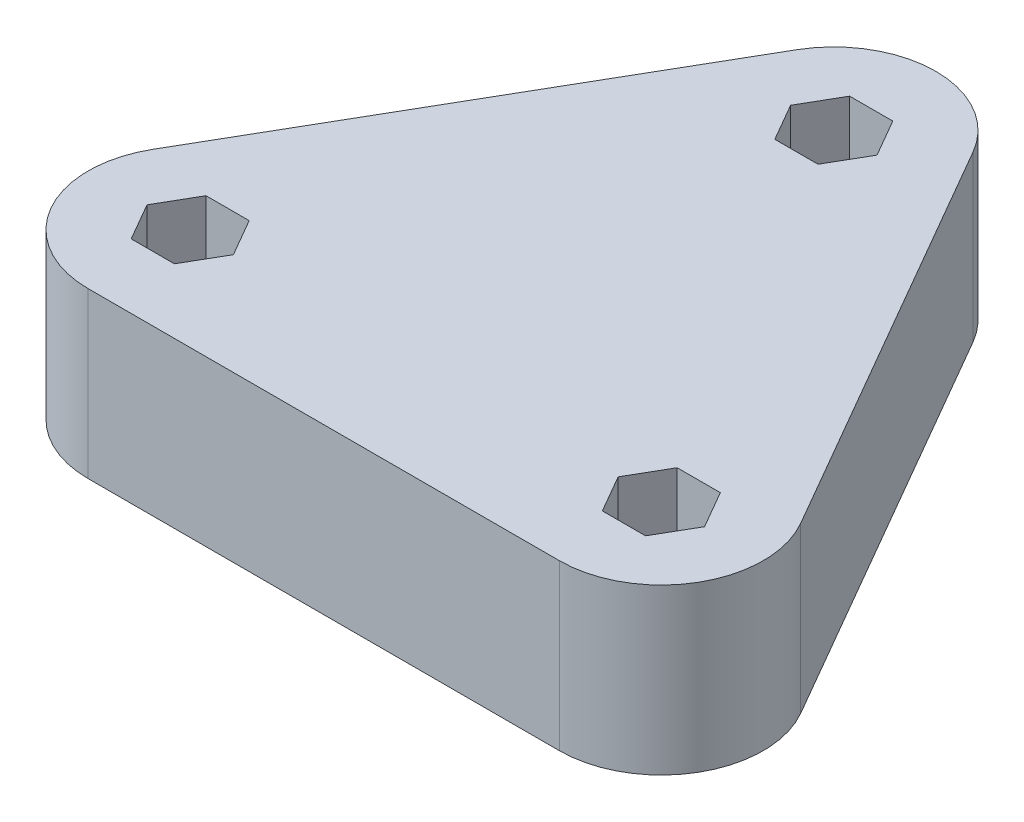
ISO-10303-21;
HEADER;
FILE_DESCRIPTION(('STEP AP214'),'2;1');
FILE_NAME('part.step','',(''),(''),'','','');
FILE_SCHEMA(('AUTOMOTIVE_DESIGN { 1 0 10303 214 1 1 1 1 }'));
ENDSEC;
DATA;
#1=APPLICATION_CONTEXT('core data for automotive mechanical design processes');
#2=APPLICATION_PROTOCOL_DEFINITION('international standard','automotive_design',2000,#1);
#3=PRODUCT_CONTEXT('',#1,'mechanical');
#4=PRODUCT('Part','Part','',(#3));
#5=PRODUCT_RELATED_PRODUCT_CATEGORY('part','',(#4));
#6=PRODUCT_DEFINITION_FORMATION('','',#4);
#7=PRODUCT_DEFINITION_CONTEXT('part definition',#1,'design');
#8=PRODUCT_DEFINITION('design','',#6,#7);
#9=PRODUCT_DEFINITION_SHAPE('','',#8);
#10=(LENGTH_UNIT() NAMED_UNIT(*) SI_UNIT(.MILLI.,.METRE.));
#11=(NAMED_UNIT(*) PLANE_ANGLE_UNIT() SI_UNIT($,.RADIAN.));
#12=(NAMED_UNIT(*) SI_UNIT($,.STERADIAN.) SOLID_ANGLE_UNIT());
#13=UNCERTAINTY_MEASURE_WITH_UNIT(LENGTH_MEASURE(1.E-05),#10,'distance_accuracy_value','');
#14=(GEOMETRIC_REPRESENTATION_CONTEXT(3) GLOBAL_UNCERTAINTY_ASSIGNED_CONTEXT((#13)) GLOBAL_UNIT_ASSIGNED_CONTEXT((#10,
#11,#12)) REPRESENTATION_CONTEXT('',''));
#15=CARTESIAN_POINT('',(0.,0.,0.));
#16=DIRECTION('',(0.,0.,1.));
#17=DIRECTION('',(1.,0.,0.));
#18=AXIS2_PLACEMENT_3D('',#15,#16,#17);
#19=CARTESIAN_POINT('',(0.,12.1,-20.));
#20=DIRECTION('',(0.,1.,0.));
#21=DIRECTION('',(0.,0.,1.));
#22=AXIS2_PLACEMENT_3D('',#19,#20,#21);
#23=PLANE('',#22);
#24=CARTESIAN_POINT('',(0.,12.1,-20.));
#25=DIRECTION('',(0.,1.,0.));
#26=DIRECTION('',(0.,0.,1.));
#27=AXIS2_PLACEMENT_3D('',#24,#25,#26);
#28=CIRCLE('',#27,7.49999999999992);
#29=CARTESIAN_POINT('',(6.49519052838323,12.1,-23.7499999999999));
#30=VERTEX_POINT('',#29);
#31=CARTESIAN_POINT('',(-6.49519052838323,12.1,-23.7499999999999));
#32=VERTEX_POINT('',#31);
#33=EDGE_CURVE('E375',#30,#32,#28,.T.);
#34=ORIENTED_EDGE('',*,*,#33,.T.);
#35=DIRECTION('',(-0.499999999999998,0.,0.86602540378444));
#36=VECTOR('',#35,1.);
#37=CARTESIAN_POINT('',(-6.49519052838323,12.1,-23.7499999999999));
#38=LINE('',#37,#36);
#39=CARTESIAN_POINT('',(-23.815698604072,12.1,6.25000000000013));
#40=VERTEX_POINT('',#39);
#41=EDGE_CURVE('E378',#32,#40,#38,.T.);
#42=ORIENTED_EDGE('',*,*,#41,.T.);
#43=CARTESIAN_POINT('',(-17.3205080756887,12.1,10.0000000000001));
#44=DIRECTION('',(0.,1.,0.));
#45=DIRECTION('',(0.,0.,1.));
#46=AXIS2_PLACEMENT_3D('',#43,#44,#45);
#47=CIRCLE('',#46,7.49999999999993);
#48=CARTESIAN_POINT('',(-17.3205080756887,12.1,17.5));
#49=VERTEX_POINT('',#48);
#50=EDGE_CURVE('E380',#40,#49,#47,.T.);
#51=ORIENTED_EDGE('',*,*,#50,.T.);
#52=DIRECTION('',(1.,0.,0.));
#53=VECTOR('',#52,1.);
#54=CARTESIAN_POINT('',(-17.3205080756887,12.1,17.5));
#55=LINE('',#54,#53);
#56=CARTESIAN_POINT('',(17.3205080756887,12.1,17.5));
#57=VERTEX_POINT('',#56);
#58=EDGE_CURVE('E382',#49,#57,#55,.T.);
#59=ORIENTED_EDGE('',*,*,#58,.T.);
#60=CARTESIAN_POINT('',(17.3205080756887,12.1,10.0000000000001));
#61=DIRECTION('',(0.,1.,0.));
#62=DIRECTION('',(0.,0.,1.));
#63=AXIS2_PLACEMENT_3D('',#60,#61,#62);
#64=CIRCLE('',#63,7.49999999999993);
#65=CARTESIAN_POINT('',(23.815698604072,12.1,6.25000000000013));
#66=VERTEX_POINT('',#65);
#67=EDGE_CURVE('E384',#57,#66,#64,.T.);
#68=ORIENTED_EDGE('',*,*,#67,.T.);
#69=DIRECTION('',(-0.499999999999998,0.,-0.86602540378444));
#70=VECTOR('',#69,1.);
#71=CARTESIAN_POINT('',(23.815698604072,12.1,6.25000000000013));
#72=LINE('',#71,#70);
#73=EDGE_CURVE('E386',#66,#30,#72,.T.);
#74=ORIENTED_EDGE('',*,*,#73,.T.);
#75=EDGE_LOOP('',(#34,#42,#51,#59,#68,#74));
#76=FACE_BOUND('',#75,.T.);
#77=DIRECTION('',(-0.499999999999999,0.,0.866025403784439));
#78=VECTOR('',#77,1.);
#79=CARTESIAN_POINT('',(-1.58771324027147,12.1,-22.75));
#80=LINE('',#79,#78);
#81=CARTESIAN_POINT('',(-1.58771324027147,12.1,-22.75));
#82=VERTEX_POINT('',#81);
#83=CARTESIAN_POINT('',(-3.17542648054294,12.1,-20.));
#84=VERTEX_POINT('',#83);
#85=EDGE_CURVE('E352',#82,#84,#80,.T.);
#86=ORIENTED_EDGE('',*,*,#85,.F.);
#87=DIRECTION('',(-1.,0.,0.));
#88=VECTOR('',#87,1.);
#89=CARTESIAN_POINT('',(1.58771324027147,12.1,-22.75));
#90=LINE('',#89,#88);
#91=CARTESIAN_POINT('',(1.58771324027147,12.1,-22.75));
#92=VERTEX_POINT('',#91);
#93=EDGE_CURVE('E350',#92,#82,#90,.T.);
#94=ORIENTED_EDGE('',*,*,#93,.F.);
#95=DIRECTION('',(-0.5,0.,-0.866025403784439));
#96=VECTOR('',#95,1.);
#97=CARTESIAN_POINT('',(3.17542648054294,12.1,-20.));
#98=LINE('',#97,#96);
#99=CARTESIAN_POINT('',(3.17542648054294,12.1,-20.));
#100=VERTEX_POINT('',#99);
#101=EDGE_CURVE('E361',#100,#92,#98,.T.);
#102=ORIENTED_EDGE('',*,*,#101,.F.);
#103=DIRECTION('',(0.5,0.,-0.866025403784439));
#104=VECTOR('',#103,1.);
#105=CARTESIAN_POINT('',(1.58771324027147,12.1,-17.25));
#106=LINE('',#105,#104);
#107=CARTESIAN_POINT('',(1.58771324027147,12.1,-17.25));
#108=VERTEX_POINT('',#107);
#109=EDGE_CURVE('E358',#108,#100,#106,.T.);
#110=ORIENTED_EDGE('',*,*,#109,.F.);
#111=DIRECTION('',(1.,0.,0.));
#112=VECTOR('',#111,1.);
#113=CARTESIAN_POINT('',(-1.58771324027147,12.1,-17.25));
#114=LINE('',#113,#112);
#115=CARTESIAN_POINT('',(-1.58771324027147,12.1,-17.25));
#116=VERTEX_POINT('',#115);
#117=EDGE_CURVE('E356',#116,#108,#114,.T.);
#118=ORIENTED_EDGE('',*,*,#117,.F.);
#119=DIRECTION('',(0.5,0.,0.866025403784439));
#120=VECTOR('',#119,1.);
#121=CARTESIAN_POINT('',(-3.17542648054294,12.1,-20.));
#122=LINE('',#121,#120);
#123=EDGE_CURVE('E354',#84,#116,#122,.T.);
#124=ORIENTED_EDGE('',*,*,#123,.F.);
#125=EDGE_LOOP('',(#86,#94,#102,#110,#118,#124));
#126=FACE_BOUND('',#125,.T.);
#127=DIRECTION('',(0.5,0.,-0.866025403784439));
#128=VECTOR('',#127,1.);
#129=CARTESIAN_POINT('',(18.9082213159602,12.1,12.7500000000001));
#130=LINE('',#129,#128);
#131=CARTESIAN_POINT('',(18.9082213159602,12.1,12.7500000000001));
#132=VERTEX_POINT('',#131);
#133=CARTESIAN_POINT('',(20.4959345562317,12.1,10.0000000000001));
#134=VERTEX_POINT('',#133);
#135=EDGE_CURVE('E334',#132,#134,#130,.T.);
#136=ORIENTED_EDGE('',*,*,#135,.F.);
#137=DIRECTION('',(1.,0.,0.));
#138=VECTOR('',#137,1.);
#139=CARTESIAN_POINT('',(15.7327948354173,12.1,12.7500000000001));
#140=LINE('',#139,#138);
#141=CARTESIAN_POINT('',(15.7327948354173,12.1,12.7500000000001));
#142=VERTEX_POINT('',#141);
#143=EDGE_CURVE('E332',#142,#132,#140,.T.);
#144=ORIENTED_EDGE('',*,*,#143,.F.);
#145=DIRECTION('',(0.500000000000001,0.,0.866025403784438));
#146=VECTOR('',#145,1.);
#147=CARTESIAN_POINT('',(14.1450815951458,12.1,10.0000000000001));
#148=LINE('',#147,#146);
#149=CARTESIAN_POINT('',(14.1450815951458,12.1,10.0000000000001));
#150=VERTEX_POINT('',#149);
#151=EDGE_CURVE('E341',#150,#142,#148,.T.);
#152=ORIENTED_EDGE('',*,*,#151,.F.);
#153=DIRECTION('',(-0.500000000000001,0.,0.866025403784438));
#154=VECTOR('',#153,1.);
#155=CARTESIAN_POINT('',(15.7327948354173,12.1,7.25000000000008));
#156=LINE('',#155,#154);
#157=CARTESIAN_POINT('',(15.7327948354173,12.1,7.25000000000008));
#158=VERTEX_POINT('',#157);
#159=EDGE_CURVE('E339',#158,#150,#156,.T.);
#160=ORIENTED_EDGE('',*,*,#159,.F.);
#161=DIRECTION('',(-1.,0.,0.));
#162=VECTOR('',#161,1.);
#163=CARTESIAN_POINT('',(18.9082213159602,12.1,7.25000000000007));
#164=LINE('',#163,#162);
#165=CARTESIAN_POINT('',(18.9082213159602,12.1,7.25000000000007));
#166=VERTEX_POINT('',#165);
#167=EDGE_CURVE('E337',#166,#158,#164,.T.);
#168=ORIENTED_EDGE('',*,*,#167,.F.);
#169=DIRECTION('',(-0.500000000000001,0.,-0.866025403784438));
#170=VECTOR('',#169,1.);
#171=CARTESIAN_POINT('',(20.4959345562317,12.1,10.0000000000001));
#172=LINE('',#171,#170);
#173=EDGE_CURVE('E201',#134,#166,#172,.T.);
#174=ORIENTED_EDGE('',*,*,#173,.F.);
#175=EDGE_LOOP('',(#136,#144,#152,#160,#168,#174));
#176=FACE_BOUND('',#175,.T.);
#177=DIRECTION('',(-0.5,0.,0.866025403784439));
#178=VECTOR('',#177,1.);
#179=CARTESIAN_POINT('',(-18.9082213159602,12.1,7.25000000000008));
#180=LINE('',#179,#178);
#181=CARTESIAN_POINT('',(-18.9082213159602,12.1,7.25000000000008));
#182=VERTEX_POINT('',#181);
#183=CARTESIAN_POINT('',(-20.4959345562317,12.1,10.0000000000001));
#184=VERTEX_POINT('',#183);
#185=EDGE_CURVE('E311',#182,#184,#180,.T.);
#186=ORIENTED_EDGE('',*,*,#185,.F.);
#187=DIRECTION('',(-1.,0.,0.));
#188=VECTOR('',#187,1.);
#189=CARTESIAN_POINT('',(-15.7327948354173,12.1,7.25000000000008));
#190=LINE('',#189,#188);
#191=CARTESIAN_POINT('',(-15.7327948354173,12.1,7.25000000000008));
#192=VERTEX_POINT('',#191);
#193=EDGE_CURVE('E309',#192,#182,#190,.T.);
#194=ORIENTED_EDGE('',*,*,#193,.F.);
#195=DIRECTION('',(-0.5,0.,-0.866025403784439));
#196=VECTOR('',#195,1.);
#197=CARTESIAN_POINT('',(-14.1450815951458,12.1,10.0000000000001));
#198=LINE('',#197,#196);
#199=CARTESIAN_POINT('',(-14.1450815951458,12.1,10.0000000000001));
#200=VERTEX_POINT('',#199);
#201=EDGE_CURVE('E319',#200,#192,#198,.T.);
#202=ORIENTED_EDGE('',*,*,#201,.F.);
#203=DIRECTION('',(0.5,0.,-0.866025403784439));
#204=VECTOR('',#203,1.);
#205=CARTESIAN_POINT('',(-15.7327948354173,12.1,12.7500000000001));
#206=LINE('',#205,#204);
#207=CARTESIAN_POINT('',(-15.7327948354173,12.1,12.7500000000001));
#208=VERTEX_POINT('',#207);
#209=EDGE_CURVE('E317',#208,#200,#206,.T.);
#210=ORIENTED_EDGE('',*,*,#209,.F.);
#211=DIRECTION('',(1.,0.,0.));
#212=VECTOR('',#211,1.);
#213=CARTESIAN_POINT('',(-18.9082213159602,12.1,12.7500000000001));
#214=LINE('',#213,#212);
#215=CARTESIAN_POINT('',(-18.9082213159602,12.1,12.7500000000001));
#216=VERTEX_POINT('',#215);
#217=EDGE_CURVE('E315',#216,#208,#214,.T.);
#218=ORIENTED_EDGE('',*,*,#217,.F.);
#219=DIRECTION('',(0.5,0.,0.866025403784439));
#220=VECTOR('',#219,1.);
#221=CARTESIAN_POINT('',(-20.4959345562317,12.1,10.0000000000001));
#222=LINE('',#221,#220);
#223=EDGE_CURVE('E313',#184,#216,#222,.T.);
#224=ORIENTED_EDGE('',*,*,#223,.F.);
#225=EDGE_LOOP('',(#186,#194,#202,#210,#218,#224));
#226=FACE_BOUND('',#225,.T.);
#227=ADVANCED_FACE('F32',(#76,#126,#176,#226),#23,.T.);
#228=CARTESIAN_POINT('',(0.,12.1,-20.));
#229=DIRECTION('',(0.,-1.,0.));
#230=DIRECTION('',(0.,0.,-1.));
#231=AXIS2_PLACEMENT_3D('',#228,#229,#230);
#232=CYLINDRICAL_SURFACE('',#231,7.49999999999992);
#233=DIRECTION('',(0.,-1.,0.));
#234=VECTOR('',#233,1.);
#235=CARTESIAN_POINT('',(6.49519052838323,12.1,-23.7499999999999));
#236=LINE('',#235,#234);
#237=CARTESIAN_POINT('',(6.49519052838323,0.,-23.7499999999999));
#238=VERTEX_POINT('',#237);
#239=EDGE_CURVE('E388',#30,#238,#236,.T.);
#240=ORIENTED_EDGE('',*,*,#239,.T.);
#241=CARTESIAN_POINT('',(0.,0.,-20.));
#242=DIRECTION('',(0.,1.,0.));
#243=DIRECTION('',(0.,0.,1.));
#244=AXIS2_PLACEMENT_3D('',#241,#242,#243);
#245=CIRCLE('',#244,7.49999999999992);
#246=CARTESIAN_POINT('',(-6.49519052838323,0.,-23.7499999999999));
#247=VERTEX_POINT('',#246);
#248=EDGE_CURVE('E282',#238,#247,#245,.T.);
#249=ORIENTED_EDGE('',*,*,#248,.T.);
#250=DIRECTION('',(0.,-1.,0.));
#251=VECTOR('',#250,1.);
#252=CARTESIAN_POINT('',(-6.49519052838323,12.1,-23.7499999999999));
#253=LINE('',#252,#251);
#254=EDGE_CURVE('E40',#32,#247,#253,.T.);
#255=ORIENTED_EDGE('',*,*,#254,.F.);
#256=ORIENTED_EDGE('',*,*,#33,.F.);
#257=EDGE_LOOP('',(#240,#249,#255,#256));
#258=FACE_BOUND('',#257,.T.);
#259=ADVANCED_FACE('F411',(#258),#232,.T.);
#260=CARTESIAN_POINT('',(-6.49519052838323,12.1,-23.7499999999999));
#261=DIRECTION('',(0.86602540378444,0.,0.499999999999998));
#262=DIRECTION('',(0.499999999999998,0.,-0.86602540378444));
#263=AXIS2_PLACEMENT_3D('',#260,#261,#262);
#264=PLANE('',#263);
#265=ORIENTED_EDGE('',*,*,#254,.T.);
#266=DIRECTION('',(-0.499999999999998,0.,0.86602540378444));
#267=VECTOR('',#266,1.);
#268=CARTESIAN_POINT('',(-6.49519052838323,0.,-23.7499999999999));
#269=LINE('',#268,#267);
#270=CARTESIAN_POINT('',(-23.815698604072,0.,6.25000000000013));
#271=VERTEX_POINT('',#270);
#272=EDGE_CURVE('E285',#247,#271,#269,.T.);
#273=ORIENTED_EDGE('',*,*,#272,.T.);
#274=DIRECTION('',(0.,-1.,0.));
#275=VECTOR('',#274,1.);
#276=CARTESIAN_POINT('',(-23.815698604072,12.1,6.25000000000013));
#277=LINE('',#276,#275);
#278=EDGE_CURVE('E396',#40,#271,#277,.T.);
#279=ORIENTED_EDGE('',*,*,#278,.F.);
#280=ORIENTED_EDGE('',*,*,#41,.F.);
#281=EDGE_LOOP('',(#265,#273,#279,#280));
#282=FACE_BOUND('',#281,.T.);
#283=ADVANCED_FACE('F400',(#282),#264,.F.);
#284=CARTESIAN_POINT('',(-17.3205080756887,12.1,10.0000000000001));
#285=DIRECTION('',(0.,-1.,0.));
#286=DIRECTION('',(0.,0.,-1.));
#287=AXIS2_PLACEMENT_3D('',#284,#285,#286);
#288=CYLINDRICAL_SURFACE('',#287,7.49999999999993);
#289=ORIENTED_EDGE('',*,*,#278,.T.);
#290=CARTESIAN_POINT('',(-17.3205080756887,0.,10.0000000000001));
#291=DIRECTION('',(0.,1.,0.));
#292=DIRECTION('',(0.,0.,1.));
#293=AXIS2_PLACEMENT_3D('',#290,#291,#292);
#294=CIRCLE('',#293,7.49999999999993);
#295=CARTESIAN_POINT('',(-17.3205080756887,0.,17.5));
#296=VERTEX_POINT('',#295);
#297=EDGE_CURVE('E288',#271,#296,#294,.T.);
#298=ORIENTED_EDGE('',*,*,#297,.T.);
#299=DIRECTION('',(0.,-1.,0.));
#300=VECTOR('',#299,1.);
#301=CARTESIAN_POINT('',(-17.3205080756887,12.1,17.5));
#302=LINE('',#301,#300);
#303=EDGE_CURVE('E394',#49,#296,#302,.T.);
#304=ORIENTED_EDGE('',*,*,#303,.F.);
#305=ORIENTED_EDGE('',*,*,#50,.F.);
#306=EDGE_LOOP('',(#289,#298,#304,#305));
#307=FACE_BOUND('',#306,.T.);
#308=ADVANCED_FACE('F428',(#307),#288,.T.);
#309=CARTESIAN_POINT('',(-17.3205080756887,12.1,17.5));
#310=DIRECTION('',(0.,0.,-1.));
#311=DIRECTION('',(-1.,0.,0.));
#312=AXIS2_PLACEMENT_3D('',#309,#310,#311);
#313=PLANE('',#312);
#314=ORIENTED_EDGE('',*,*,#303,.T.);
#315=DIRECTION('',(1.,0.,0.));
#316=VECTOR('',#315,1.);
#317=CARTESIAN_POINT('',(-17.3205080756887,0.,17.5));
#318=LINE('',#317,#316);
#319=CARTESIAN_POINT('',(17.3205080756887,0.,17.5));
#320=VERTEX_POINT('',#319);
#321=EDGE_CURVE('E291',#296,#320,#318,.T.);
#322=ORIENTED_EDGE('',*,*,#321,.T.);
#323=DIRECTION('',(0.,-1.,0.));
#324=VECTOR('',#323,1.);
#325=CARTESIAN_POINT('',(17.3205080756887,12.1,17.5));
#326=LINE('',#325,#324);
#327=EDGE_CURVE('E392',#57,#320,#326,.T.);
#328=ORIENTED_EDGE('',*,*,#327,.F.);
#329=ORIENTED_EDGE('',*,*,#58,.F.);
#330=EDGE_LOOP('',(#314,#322,#328,#329));
#331=FACE_BOUND('',#330,.T.);
#332=ADVANCED_FACE('F424',(#331),#313,.F.);
#333=CARTESIAN_POINT('',(17.3205080756887,12.1,10.0000000000001));
#334=DIRECTION('',(0.,-1.,0.));
#335=DIRECTION('',(0.,0.,-1.));
#336=AXIS2_PLACEMENT_3D('',#333,#334,#335);
#337=CYLINDRICAL_SURFACE('',#336,7.49999999999993);
#338=ORIENTED_EDGE('',*,*,#327,.T.);
#339=CARTESIAN_POINT('',(17.3205080756887,0.,10.0000000000001));
#340=DIRECTION('',(0.,1.,0.));
#341=DIRECTION('',(0.,0.,1.));
#342=AXIS2_PLACEMENT_3D('',#339,#340,#341);
#343=CIRCLE('',#342,7.49999999999993);
#344=CARTESIAN_POINT('',(23.815698604072,0.,6.25000000000013));
#345=VERTEX_POINT('',#344);
#346=EDGE_CURVE('E294',#320,#345,#343,.T.);
#347=ORIENTED_EDGE('',*,*,#346,.T.);
#348=DIRECTION('',(0.,-1.,0.));
#349=VECTOR('',#348,1.);
#350=CARTESIAN_POINT('',(23.815698604072,12.1,6.25000000000013));
#351=LINE('',#350,#349);
#352=EDGE_CURVE('E390',#66,#345,#351,.T.);
#353=ORIENTED_EDGE('',*,*,#352,.F.);
#354=ORIENTED_EDGE('',*,*,#67,.F.);
#355=EDGE_LOOP('',(#338,#347,#353,#354));
#356=FACE_BOUND('',#355,.T.);
#357=ADVANCED_FACE('F419',(#356),#337,.T.);
#358=CARTESIAN_POINT('',(23.815698604072,12.1,6.25000000000013));
#359=DIRECTION('',(-0.86602540378444,0.,0.499999999999998));
#360=DIRECTION('',(0.499999999999998,0.,0.86602540378444));
#361=AXIS2_PLACEMENT_3D('',#358,#359,#360);
#362=PLANE('',#361);
#363=ORIENTED_EDGE('',*,*,#352,.T.);
#364=DIRECTION('',(-0.499999999999998,0.,-0.86602540378444));
#365=VECTOR('',#364,1.);
#366=CARTESIAN_POINT('',(6.49519052838323,0.,-23.7499999999999));
#367=LINE('',#366,#365);
#368=EDGE_CURVE('E297',#345,#238,#367,.T.);
#369=ORIENTED_EDGE('',*,*,#368,.T.);
#370=ORIENTED_EDGE('',*,*,#239,.F.);
#371=ORIENTED_EDGE('',*,*,#73,.F.);
#372=EDGE_LOOP('',(#363,#369,#370,#371));
#373=FACE_BOUND('',#372,.T.);
#374=ADVANCED_FACE('F415',(#373),#362,.F.);
#375=CARTESIAN_POINT('',(1.58771324027147,12.1,-22.75));
#376=DIRECTION('',(0.,0.,1.));
#377=DIRECTION('',(1.,0.,0.));
#378=AXIS2_PLACEMENT_3D('',#375,#376,#377);
#379=PLANE('',#378);
#380=DIRECTION('',(0.,-1.,0.));
#381=VECTOR('',#380,1.);
#382=CARTESIAN_POINT('',(-1.58771324027147,12.1,-22.75));
#383=LINE('',#382,#381);
#384=CARTESIAN_POINT('',(-1.58771324027147,7.,-22.75));
#385=VERTEX_POINT('',#384);
#386=EDGE_CURVE('E373',#82,#385,#383,.T.);
#387=ORIENTED_EDGE('',*,*,#386,.T.);
#388=DIRECTION('',(-1.,0.,0.));
#389=VECTOR('',#388,1.);
#390=CARTESIAN_POINT('',(1.58771324027147,7.,-22.75));
#391=LINE('',#390,#389);
#392=CARTESIAN_POINT('',(1.58771324027147,7.,-22.75));
#393=VERTEX_POINT('',#392);
#394=EDGE_CURVE('E235',#393,#385,#391,.T.);
#395=ORIENTED_EDGE('',*,*,#394,.F.);
#396=DIRECTION('',(0.,-1.,0.));
#397=VECTOR('',#396,1.);
#398=CARTESIAN_POINT('',(1.58771324027147,12.1,-22.75));
#399=LINE('',#398,#397);
#400=EDGE_CURVE('E363',#92,#393,#399,.T.);
#401=ORIENTED_EDGE('',*,*,#400,.F.);
#402=ORIENTED_EDGE('',*,*,#93,.T.);
#403=EDGE_LOOP('',(#387,#395,#401,#402));
#404=FACE_BOUND('',#403,.T.);
#405=ADVANCED_FACE('F521',(#404),#379,.T.);
#406=CARTESIAN_POINT('',(-1.58771324027147,12.1,-22.75));
#407=DIRECTION('',(0.866025403784439,0.,0.499999999999999));
#408=DIRECTION('',(0.499999999999999,0.,-0.866025403784439));
#409=AXIS2_PLACEMENT_3D('',#406,#407,#408);
#410=PLANE('',#409);
#411=DIRECTION('',(0.,-1.,0.));
#412=VECTOR('',#411,1.);
#413=CARTESIAN_POINT('',(-3.17542648054294,12.1,-20.));
#414=LINE('',#413,#412);
#415=CARTESIAN_POINT('',(-3.17542648054294,7.,-20.));
#416=VERTEX_POINT('',#415);
#417=EDGE_CURVE('E371',#84,#416,#414,.T.);
#418=ORIENTED_EDGE('',*,*,#417,.T.);
#419=DIRECTION('',(-0.499999999999999,0.,0.866025403784439));
#420=VECTOR('',#419,1.);
#421=CARTESIAN_POINT('',(-1.58771324027147,7.,-22.75));
#422=LINE('',#421,#420);
#423=EDGE_CURVE('E238',#385,#416,#422,.T.);
#424=ORIENTED_EDGE('',*,*,#423,.F.);
#425=ORIENTED_EDGE('',*,*,#386,.F.);
#426=ORIENTED_EDGE('',*,*,#85,.T.);
#427=EDGE_LOOP('',(#418,#424,#425,#426));
#428=FACE_BOUND('',#427,.T.);
#429=ADVANCED_FACE('F517',(#428),#410,.T.);
#430=CARTESIAN_POINT('',(-3.17542648054294,12.1,-20.));
#431=DIRECTION('',(0.866025403784439,0.,-0.5));
#432=DIRECTION('',(-0.5,0.,-0.866025403784439));
#433=AXIS2_PLACEMENT_3D('',#430,#431,#432);
#434=PLANE('',#433);
#435=DIRECTION('',(0.,-1.,0.));
#436=VECTOR('',#435,1.);
#437=CARTESIAN_POINT('',(-1.58771324027147,12.1,-17.25));
#438=LINE('',#437,#436);
#439=CARTESIAN_POINT('',(-1.58771324027147,7.,-17.25));
#440=VERTEX_POINT('',#439);
#441=EDGE_CURVE('E369',#116,#440,#438,.T.);
#442=ORIENTED_EDGE('',*,*,#441,.T.);
#443=DIRECTION('',(0.5,0.,0.866025403784439));
#444=VECTOR('',#443,1.);
#445=CARTESIAN_POINT('',(-3.17542648054294,7.,-20.));
#446=LINE('',#445,#444);
#447=EDGE_CURVE('E241',#416,#440,#446,.T.);
#448=ORIENTED_EDGE('',*,*,#447,.F.);
#449=ORIENTED_EDGE('',*,*,#417,.F.);
#450=ORIENTED_EDGE('',*,*,#123,.T.);
#451=EDGE_LOOP('',(#442,#448,#449,#450));
#452=FACE_BOUND('',#451,.T.);
#453=ADVANCED_FACE('F513',(#452),#434,.T.);
#454=CARTESIAN_POINT('',(-1.58771324027147,12.1,-17.25));
#455=DIRECTION('',(0.,0.,-1.));
#456=DIRECTION('',(-1.,0.,0.));
#457=AXIS2_PLACEMENT_3D('',#454,#455,#456);
#458=PLANE('',#457);
#459=DIRECTION('',(0.,-1.,0.));
#460=VECTOR('',#459,1.);
#461=CARTESIAN_POINT('',(1.58771324027147,12.1,-17.25));
#462=LINE('',#461,#460);
#463=CARTESIAN_POINT('',(1.58771324027147,7.,-17.25));
#464=VERTEX_POINT('',#463);
#465=EDGE_CURVE('E367',#108,#464,#462,.T.);
#466=ORIENTED_EDGE('',*,*,#465,.T.);
#467=DIRECTION('',(1.,0.,0.));
#468=VECTOR('',#467,1.);
#469=CARTESIAN_POINT('',(-1.58771324027147,7.,-17.25));
#470=LINE('',#469,#468);
#471=EDGE_CURVE('E244',#440,#464,#470,.T.);
#472=ORIENTED_EDGE('',*,*,#471,.F.);
#473=ORIENTED_EDGE('',*,*,#441,.F.);
#474=ORIENTED_EDGE('',*,*,#117,.T.);
#475=EDGE_LOOP('',(#466,#472,#473,#474));
#476=FACE_BOUND('',#475,.T.);
#477=ADVANCED_FACE('F509',(#476),#458,.T.);
#478=CARTESIAN_POINT('',(1.58771324027147,12.1,-17.25));
#479=DIRECTION('',(-0.866025403784439,0.,-0.5));
#480=DIRECTION('',(-0.5,0.,0.866025403784439));
#481=AXIS2_PLACEMENT_3D('',#478,#479,#480);
#482=PLANE('',#481);
#483=DIRECTION('',(0.,-1.,0.));
#484=VECTOR('',#483,1.);
#485=CARTESIAN_POINT('',(3.17542648054294,12.1,-20.));
#486=LINE('',#485,#484);
#487=CARTESIAN_POINT('',(3.17542648054294,7.,-20.));
#488=VERTEX_POINT('',#487);
#489=EDGE_CURVE('E365',#100,#488,#486,.T.);
#490=ORIENTED_EDGE('',*,*,#489,.T.);
#491=DIRECTION('',(0.5,0.,-0.866025403784439));
#492=VECTOR('',#491,1.);
#493=CARTESIAN_POINT('',(1.58771324027147,7.,-17.25));
#494=LINE('',#493,#492);
#495=EDGE_CURVE('E247',#464,#488,#494,.T.);
#496=ORIENTED_EDGE('',*,*,#495,.F.);
#497=ORIENTED_EDGE('',*,*,#465,.F.);
#498=ORIENTED_EDGE('',*,*,#109,.T.);
#499=EDGE_LOOP('',(#490,#496,#497,#498));
#500=FACE_BOUND('',#499,.T.);
#501=ADVANCED_FACE('F505',(#500),#482,.T.);
#502=CARTESIAN_POINT('',(3.17542648054294,12.1,-20.));
#503=DIRECTION('',(-0.866025403784439,0.,0.5));
#504=DIRECTION('',(0.5,0.,0.866025403784439));
#505=AXIS2_PLACEMENT_3D('',#502,#503,#504);
#506=PLANE('',#505);
#507=ORIENTED_EDGE('',*,*,#400,.T.);
#508=DIRECTION('',(-0.5,0.,-0.866025403784439));
#509=VECTOR('',#508,1.);
#510=CARTESIAN_POINT('',(3.17542648054294,7.,-20.));
#511=LINE('',#510,#509);
#512=EDGE_CURVE('E250',#488,#393,#511,.T.);
#513=ORIENTED_EDGE('',*,*,#512,.F.);
#514=ORIENTED_EDGE('',*,*,#489,.F.);
#515=ORIENTED_EDGE('',*,*,#101,.T.);
#516=EDGE_LOOP('',(#507,#513,#514,#515));
#517=FACE_BOUND('',#516,.T.);
#518=ADVANCED_FACE('F501',(#517),#506,.T.);
#519=CARTESIAN_POINT('',(15.7327948354173,12.1,12.7500000000001));
#520=DIRECTION('',(0.,0.,-1.));
#521=DIRECTION('',(-1.,0.,0.));
#522=AXIS2_PLACEMENT_3D('',#519,#520,#521);
#523=PLANE('',#522);
#524=DIRECTION('',(0.,-1.,0.));
#525=VECTOR('',#524,1.);
#526=CARTESIAN_POINT('',(18.9082213159602,12.1,12.7500000000001));
#527=LINE('',#526,#525);
#528=CARTESIAN_POINT('',(18.9082213159602,7.,12.7500000000001));
#529=VERTEX_POINT('',#528);
#530=EDGE_CURVE('E348',#132,#529,#527,.T.);
#531=ORIENTED_EDGE('',*,*,#530,.T.);
#532=DIRECTION('',(1.,0.,0.));
#533=VECTOR('',#532,1.);
#534=CARTESIAN_POINT('',(15.7327948354173,7.,12.7500000000001));
#535=LINE('',#534,#533);
#536=CARTESIAN_POINT('',(15.7327948354173,7.,12.7500000000001));
#537=VERTEX_POINT('',#536);
#538=EDGE_CURVE('E231',#537,#529,#535,.T.);
#539=ORIENTED_EDGE('',*,*,#538,.F.);
#540=DIRECTION('',(0.,-1.,0.));
#541=VECTOR('',#540,1.);
#542=CARTESIAN_POINT('',(15.7327948354173,12.1,12.7500000000001));
#543=LINE('',#542,#541);
#544=EDGE_CURVE('E343',#142,#537,#543,.T.);
#545=ORIENTED_EDGE('',*,*,#544,.F.);
#546=ORIENTED_EDGE('',*,*,#143,.T.);
#547=EDGE_LOOP('',(#531,#539,#545,#546));
#548=FACE_BOUND('',#547,.T.);
#549=ADVANCED_FACE('F497',(#548),#523,.T.);
#550=CARTESIAN_POINT('',(18.9082213159602,12.1,12.7500000000001));
#551=DIRECTION('',(-0.866025403784439,0.,-0.5));
#552=DIRECTION('',(-0.5,0.,0.866025403784439));
#553=AXIS2_PLACEMENT_3D('',#550,#551,#552);
#554=PLANE('',#553);
#555=DIRECTION('',(0.,-1.,0.));
#556=VECTOR('',#555,1.);
#557=CARTESIAN_POINT('',(20.4959345562317,12.1,10.0000000000001));
#558=LINE('',#557,#556);
#559=CARTESIAN_POINT('',(20.4959345562317,7.,10.0000000000001));
#560=VERTEX_POINT('',#559);
#561=EDGE_CURVE('E204',#134,#560,#558,.T.);
#562=ORIENTED_EDGE('',*,*,#561,.T.);
#563=DIRECTION('',(0.5,0.,-0.866025403784439));
#564=VECTOR('',#563,1.);
#565=CARTESIAN_POINT('',(18.9082213159602,7.,12.7500000000001));
#566=LINE('',#565,#564);
#567=EDGE_CURVE('E219',#529,#560,#566,.T.);
#568=ORIENTED_EDGE('',*,*,#567,.F.);
#569=ORIENTED_EDGE('',*,*,#530,.F.);
#570=ORIENTED_EDGE('',*,*,#135,.T.);
#571=EDGE_LOOP('',(#562,#568,#569,#570));
#572=FACE_BOUND('',#571,.T.);
#573=ADVANCED_FACE('F494',(#572),#554,.T.);
#574=CARTESIAN_POINT('',(20.4959345562317,12.1,10.0000000000001));
#575=DIRECTION('',(-0.866025403784438,0.,0.500000000000001));
#576=DIRECTION('',(0.500000000000001,0.,0.866025403784438));
#577=AXIS2_PLACEMENT_3D('',#574,#575,#576);
#578=PLANE('',#577);
#579=DIRECTION('',(0.,-1.,0.));
#580=VECTOR('',#579,1.);
#581=CARTESIAN_POINT('',(18.9082213159602,12.1,7.25000000000007));
#582=LINE('',#581,#580);
#583=CARTESIAN_POINT('',(18.9082213159602,7.,7.25000000000008));
#584=VERTEX_POINT('',#583);
#585=EDGE_CURVE('E193',#166,#584,#582,.T.);
#586=ORIENTED_EDGE('',*,*,#585,.T.);
#587=DIRECTION('',(-0.500000000000001,0.,-0.866025403784438));
#588=VECTOR('',#587,1.);
#589=CARTESIAN_POINT('',(20.4959345562317,7.,10.0000000000001));
#590=LINE('',#589,#588);
#591=EDGE_CURVE('E198',#560,#584,#590,.T.);
#592=ORIENTED_EDGE('',*,*,#591,.F.);
#593=ORIENTED_EDGE('',*,*,#561,.F.);
#594=ORIENTED_EDGE('',*,*,#173,.T.);
#595=EDGE_LOOP('',(#586,#592,#593,#594));
#596=FACE_BOUND('',#595,.T.);
#597=ADVANCED_FACE('F195',(#596),#578,.T.);
#598=CARTESIAN_POINT('',(18.9082213159602,12.1,7.25000000000007));
#599=DIRECTION('',(0.,0.,1.));
#600=DIRECTION('',(1.,0.,0.));
#601=AXIS2_PLACEMENT_3D('',#598,#599,#600);
#602=PLANE('',#601);
#603=DIRECTION('',(0.,-1.,0.));
#604=VECTOR('',#603,1.);
#605=CARTESIAN_POINT('',(15.7327948354173,12.1,7.25000000000008));
#606=LINE('',#605,#604);
#607=CARTESIAN_POINT('',(15.7327948354173,7.,7.25000000000008));
#608=VERTEX_POINT('',#607);
#609=EDGE_CURVE('E205',#158,#608,#606,.T.);
#610=ORIENTED_EDGE('',*,*,#609,.T.);
#611=DIRECTION('',(-1.,0.,0.));
#612=VECTOR('',#611,1.);
#613=CARTESIAN_POINT('',(18.9082213159602,7.,7.25000000000008));
#614=LINE('',#613,#612);
#615=EDGE_CURVE('E208',#584,#608,#614,.T.);
#616=ORIENTED_EDGE('',*,*,#615,.F.);
#617=ORIENTED_EDGE('',*,*,#585,.F.);
#618=ORIENTED_EDGE('',*,*,#167,.T.);
#619=EDGE_LOOP('',(#610,#616,#617,#618));
#620=FACE_BOUND('',#619,.T.);
#621=ADVANCED_FACE('F209',(#620),#602,.T.);
#622=CARTESIAN_POINT('',(15.7327948354173,12.1,7.25000000000008));
#623=DIRECTION('',(0.866025403784438,0.,0.5));
#624=DIRECTION('',(0.5,0.,-0.866025403784438));
#625=AXIS2_PLACEMENT_3D('',#622,#623,#624);
#626=PLANE('',#625);
#627=DIRECTION('',(0.,-1.,0.));
#628=VECTOR('',#627,1.);
#629=CARTESIAN_POINT('',(14.1450815951458,12.1,10.0000000000001));
#630=LINE('',#629,#628);
#631=CARTESIAN_POINT('',(14.1450815951458,7.,10.0000000000001));
#632=VERTEX_POINT('',#631);
#633=EDGE_CURVE('E55',#150,#632,#630,.T.);
#634=ORIENTED_EDGE('',*,*,#633,.T.);
#635=DIRECTION('',(-0.500000000000001,0.,0.866025403784438));
#636=VECTOR('',#635,1.);
#637=CARTESIAN_POINT('',(15.7327948354173,7.,7.25000000000008));
#638=LINE('',#637,#636);
#639=EDGE_CURVE('E214',#608,#632,#638,.T.);
#640=ORIENTED_EDGE('',*,*,#639,.F.);
#641=ORIENTED_EDGE('',*,*,#609,.F.);
#642=ORIENTED_EDGE('',*,*,#159,.T.);
#643=EDGE_LOOP('',(#634,#640,#641,#642));
#644=FACE_BOUND('',#643,.T.);
#645=ADVANCED_FACE('F486',(#644),#626,.T.);
#646=CARTESIAN_POINT('',(14.1450815951458,12.1,10.0000000000001));
#647=DIRECTION('',(0.866025403784438,0.,-0.500000000000001));
#648=DIRECTION('',(-0.500000000000001,0.,-0.866025403784438));
#649=AXIS2_PLACEMENT_3D('',#646,#647,#648);
#650=PLANE('',#649);
#651=ORIENTED_EDGE('',*,*,#544,.T.);
#652=DIRECTION('',(0.500000000000001,0.,0.866025403784438));
#653=VECTOR('',#652,1.);
#654=CARTESIAN_POINT('',(14.1450815951458,7.,10.0000000000001));
#655=LINE('',#654,#653);
#656=EDGE_CURVE('E228',#632,#537,#655,.T.);
#657=ORIENTED_EDGE('',*,*,#656,.F.);
#658=ORIENTED_EDGE('',*,*,#633,.F.);
#659=ORIENTED_EDGE('',*,*,#151,.T.);
#660=EDGE_LOOP('',(#651,#657,#658,#659));
#661=FACE_BOUND('',#660,.T.);
#662=ADVANCED_FACE('F483',(#661),#650,.T.);
#663=CARTESIAN_POINT('',(-15.7327948354173,12.1,7.25000000000008));
#664=DIRECTION('',(0.,0.,1.));
#665=DIRECTION('',(1.,0.,0.));
#666=AXIS2_PLACEMENT_3D('',#663,#664,#665);
#667=PLANE('',#666);
#668=DIRECTION('',(0.,-1.,0.));
#669=VECTOR('',#668,1.);
#670=CARTESIAN_POINT('',(-18.9082213159602,12.1,7.25000000000008));
#671=LINE('',#670,#669);
#672=CARTESIAN_POINT('',(-18.9082213159602,7.,7.25000000000008));
#673=VERTEX_POINT('',#672);
#674=EDGE_CURVE('E330',#182,#673,#671,.T.);
#675=ORIENTED_EDGE('',*,*,#674,.T.);
#676=DIRECTION('',(-1.,0.,0.));
#677=VECTOR('',#676,1.);
#678=CARTESIAN_POINT('',(-15.7327948354173,7.,7.25000000000008));
#679=LINE('',#678,#677);
#680=CARTESIAN_POINT('',(-15.7327948354173,7.,7.25000000000008));
#681=VERTEX_POINT('',#680);
#682=EDGE_CURVE('E254',#681,#673,#679,.T.);
#683=ORIENTED_EDGE('',*,*,#682,.F.);
#684=DIRECTION('',(0.,-1.,0.));
#685=VECTOR('',#684,1.);
#686=CARTESIAN_POINT('',(-15.7327948354173,12.1,7.25000000000008));
#687=LINE('',#686,#685);
#688=EDGE_CURVE('E321',#192,#681,#687,.T.);
#689=ORIENTED_EDGE('',*,*,#688,.F.);
#690=ORIENTED_EDGE('',*,*,#193,.T.);
#691=EDGE_LOOP('',(#675,#683,#689,#690));
#692=FACE_BOUND('',#691,.T.);
#693=ADVANCED_FACE('F460',(#692),#667,.T.);
#694=CARTESIAN_POINT('',(-18.9082213159602,12.1,7.25000000000008));
#695=DIRECTION('',(0.866025403784439,0.,0.5));
#696=DIRECTION('',(0.5,0.,-0.866025403784439));
#697=AXIS2_PLACEMENT_3D('',#694,#695,#696);
#698=PLANE('',#697);
#699=DIRECTION('',(0.,-1.,0.));
#700=VECTOR('',#699,1.);
#701=CARTESIAN_POINT('',(-20.4959345562317,12.1,10.0000000000001));
#702=LINE('',#701,#700);
#703=CARTESIAN_POINT('',(-20.4959345562317,7.,10.0000000000001));
#704=VERTEX_POINT('',#703);
#705=EDGE_CURVE('E328',#184,#704,#702,.T.);
#706=ORIENTED_EDGE('',*,*,#705,.T.);
#707=DIRECTION('',(-0.5,0.,0.866025403784439));
#708=VECTOR('',#707,1.);
#709=CARTESIAN_POINT('',(-18.9082213159602,7.,7.25000000000008));
#710=LINE('',#709,#708);
#711=EDGE_CURVE('E257',#673,#704,#710,.T.);
#712=ORIENTED_EDGE('',*,*,#711,.F.);
#713=ORIENTED_EDGE('',*,*,#674,.F.);
#714=ORIENTED_EDGE('',*,*,#185,.T.);
#715=EDGE_LOOP('',(#706,#712,#713,#714));
#716=FACE_BOUND('',#715,.T.);
#717=ADVANCED_FACE('F448',(#716),#698,.T.);
#718=CARTESIAN_POINT('',(-20.4959345562317,12.1,10.0000000000001));
#719=DIRECTION('',(0.866025403784439,0.,-0.5));
#720=DIRECTION('',(-0.5,0.,-0.866025403784439));
#721=AXIS2_PLACEMENT_3D('',#718,#719,#720);
#722=PLANE('',#721);
#723=DIRECTION('',(0.,-1.,0.));
#724=VECTOR('',#723,1.);
#725=CARTESIAN_POINT('',(-18.9082213159602,12.1,12.7500000000001));
#726=LINE('',#725,#724);
#727=CARTESIAN_POINT('',(-18.9082213159602,7.,12.7500000000001));
#728=VERTEX_POINT('',#727);
#729=EDGE_CURVE('E326',#216,#728,#726,.T.);
#730=ORIENTED_EDGE('',*,*,#729,.T.);
#731=DIRECTION('',(0.5,0.,0.866025403784439));
#732=VECTOR('',#731,1.);
#733=CARTESIAN_POINT('',(-20.4959345562317,7.,10.0000000000001));
#734=LINE('',#733,#732);
#735=EDGE_CURVE('E260',#704,#728,#734,.T.);
#736=ORIENTED_EDGE('',*,*,#735,.F.);
#737=ORIENTED_EDGE('',*,*,#705,.F.);
#738=ORIENTED_EDGE('',*,*,#223,.T.);
#739=EDGE_LOOP('',(#730,#736,#737,#738));
#740=FACE_BOUND('',#739,.T.);
#741=ADVANCED_FACE('F452',(#740),#722,.T.);
#742=CARTESIAN_POINT('',(-18.9082213159602,12.1,12.7500000000001));
#743=DIRECTION('',(0.,0.,-1.));
#744=DIRECTION('',(-1.,0.,0.));
#745=AXIS2_PLACEMENT_3D('',#742,#743,#744);
#746=PLANE('',#745);
#747=DIRECTION('',(0.,-1.,0.));
#748=VECTOR('',#747,1.);
#749=CARTESIAN_POINT('',(-15.7327948354173,12.1,12.7500000000001));
#750=LINE('',#749,#748);
#751=CARTESIAN_POINT('',(-15.7327948354173,7.,12.7500000000001));
#752=VERTEX_POINT('',#751);
#753=EDGE_CURVE('E324',#208,#752,#750,.T.);
#754=ORIENTED_EDGE('',*,*,#753,.T.);
#755=DIRECTION('',(1.,0.,0.));
#756=VECTOR('',#755,1.);
#757=CARTESIAN_POINT('',(-18.9082213159602,7.,12.7500000000001));
#758=LINE('',#757,#756);
#759=EDGE_CURVE('E263',#728,#752,#758,.T.);
#760=ORIENTED_EDGE('',*,*,#759,.F.);
#761=ORIENTED_EDGE('',*,*,#729,.F.);
#762=ORIENTED_EDGE('',*,*,#217,.T.);
#763=EDGE_LOOP('',(#754,#760,#761,#762));
#764=FACE_BOUND('',#763,.T.);
#765=ADVANCED_FACE('F468',(#764),#746,.T.);
#766=CARTESIAN_POINT('',(-15.7327948354173,12.1,12.7500000000001));
#767=DIRECTION('',(-0.866025403784439,0.,-0.5));
#768=DIRECTION('',(-0.5,0.,0.866025403784439));
#769=AXIS2_PLACEMENT_3D('',#766,#767,#768);
#770=PLANE('',#769);
#771=DIRECTION('',(0.,-1.,0.));
#772=VECTOR('',#771,1.);
#773=CARTESIAN_POINT('',(-14.1450815951458,12.1,10.0000000000001));
#774=LINE('',#773,#772);
#775=CARTESIAN_POINT('',(-14.1450815951458,7.,10.0000000000001));
#776=VERTEX_POINT('',#775);
#777=EDGE_CURVE('E47',#200,#776,#774,.T.);
#778=ORIENTED_EDGE('',*,*,#777,.T.);
#779=DIRECTION('',(0.5,0.,-0.866025403784439));
#780=VECTOR('',#779,1.);
#781=CARTESIAN_POINT('',(-15.7327948354173,7.,12.7500000000001));
#782=LINE('',#781,#780);
#783=EDGE_CURVE('E266',#752,#776,#782,.T.);
#784=ORIENTED_EDGE('',*,*,#783,.F.);
#785=ORIENTED_EDGE('',*,*,#753,.F.);
#786=ORIENTED_EDGE('',*,*,#209,.T.);
#787=EDGE_LOOP('',(#778,#784,#785,#786));
#788=FACE_BOUND('',#787,.T.);
#789=ADVANCED_FACE('F465',(#788),#770,.T.);
#790=CARTESIAN_POINT('',(-14.1450815951458,12.1,10.0000000000001));
#791=DIRECTION('',(-0.866025403784439,0.,0.5));
#792=DIRECTION('',(0.5,0.,0.866025403784439));
#793=AXIS2_PLACEMENT_3D('',#790,#791,#792);
#794=PLANE('',#793);
#795=ORIENTED_EDGE('',*,*,#688,.T.);
#796=DIRECTION('',(-0.5,0.,-0.866025403784439));
#797=VECTOR('',#796,1.);
#798=CARTESIAN_POINT('',(-14.1450815951458,7.,10.0000000000001));
#799=LINE('',#798,#797);
#800=EDGE_CURVE('E269',#776,#681,#799,.T.);
#801=ORIENTED_EDGE('',*,*,#800,.F.);
#802=ORIENTED_EDGE('',*,*,#777,.F.);
#803=ORIENTED_EDGE('',*,*,#201,.T.);
#804=EDGE_LOOP('',(#795,#801,#802,#803));
#805=FACE_BOUND('',#804,.T.);
#806=ADVANCED_FACE('F461',(#805),#794,.T.);
#807=CARTESIAN_POINT('',(0.,12.,0.));
#808=DIRECTION('',(0.,-1.,0.));
#809=DIRECTION('',(0.,0.,-1.));
#810=AXIS2_PLACEMENT_3D('',#807,#808,#809);
#811=CYLINDRICAL_SURFACE('',#810,11.9);
#812=CARTESIAN_POINT('',(0.,-1.5,0.));
#813=DIRECTION('',(0.,-1.,0.));
#814=DIRECTION('',(0.,0.,-1.));
#815=AXIS2_PLACEMENT_3D('',#812,#813,#814);
#816=CIRCLE('',#815,11.9);
#817=CARTESIAN_POINT('',(0.,-1.5,-11.9));
#818=VERTEX_POINT('',#817);
#819=EDGE_CURVE('E223',#818,#818,#816,.T.);
#820=ORIENTED_EDGE('',*,*,#819,.T.);
#821=EDGE_LOOP('',(#820));
#822=FACE_BOUND('',#821,.T.);
#823=CARTESIAN_POINT('',(0.,10.,0.));
#824=DIRECTION('',(0.,1.,0.));
#825=DIRECTION('',(0.,0.,1.));
#826=AXIS2_PLACEMENT_3D('',#823,#824,#825);
#827=CIRCLE('',#826,11.9);
#828=CARTESIAN_POINT('',(0.,10.,11.9));
#829=VERTEX_POINT('',#828);
#830=EDGE_CURVE('E11',#829,#829,#827,.T.);
#831=ORIENTED_EDGE('',*,*,#830,.T.);
#832=EDGE_LOOP('',(#831));
#833=FACE_BOUND('',#832,.T.);
#834=ADVANCED_FACE('F642',(#822,#833),#811,.F.);
#835=CARTESIAN_POINT('',(0.,0.,-20.));
#836=DIRECTION('',(0.,1.,0.));
#837=DIRECTION('',(0.,0.,1.));
#838=AXIS2_PLACEMENT_3D('',#835,#836,#837);
#839=PLANE('',#838);
#840=CARTESIAN_POINT('',(17.3205080756887,0.,10.0000000000001));
#841=DIRECTION('',(0.,1.,0.));
#842=DIRECTION('',(0.,0.,1.));
#843=AXIS2_PLACEMENT_3D('',#840,#841,#842);
#844=CIRCLE('',#843,2.);
#845=CARTESIAN_POINT('',(17.3205080756887,0.,12.0000000000001));
#846=VERTEX_POINT('',#845);
#847=EDGE_CURVE('E273',#846,#846,#844,.T.);
#848=ORIENTED_EDGE('',*,*,#847,.T.);
#849=EDGE_LOOP('',(#848));
#850=FACE_BOUND('',#849,.T.);
#851=CARTESIAN_POINT('',(-17.3205080756887,0.,10.0000000000001));
#852=DIRECTION('',(0.,1.,0.));
#853=DIRECTION('',(0.,0.,1.));
#854=AXIS2_PLACEMENT_3D('',#851,#852,#853);
#855=CIRCLE('',#854,2.);
#856=CARTESIAN_POINT('',(-17.3205080756887,0.,12.0000000000001));
#857=VERTEX_POINT('',#856);
#858=EDGE_CURVE('E276',#857,#857,#855,.T.);
#859=ORIENTED_EDGE('',*,*,#858,.T.);
#860=EDGE_LOOP('',(#859));
#861=FACE_BOUND('',#860,.T.);
#862=CARTESIAN_POINT('',(0.,0.,-20.));
#863=DIRECTION('',(0.,1.,0.));
#864=DIRECTION('',(0.,0.,1.));
#865=AXIS2_PLACEMENT_3D('',#862,#863,#864);
#866=CIRCLE('',#865,2.);
#867=CARTESIAN_POINT('',(0.,0.,-18.));
#868=VERTEX_POINT('',#867);
#869=EDGE_CURVE('E279',#868,#868,#866,.T.);
#870=ORIENTED_EDGE('',*,*,#869,.T.);
#871=EDGE_LOOP('',(#870));
#872=FACE_BOUND('',#871,.T.);
#873=ORIENTED_EDGE('',*,*,#248,.F.);
#874=ORIENTED_EDGE('',*,*,#368,.F.);
#875=ORIENTED_EDGE('',*,*,#346,.F.);
#876=ORIENTED_EDGE('',*,*,#321,.F.);
#877=ORIENTED_EDGE('',*,*,#297,.F.);
#878=ORIENTED_EDGE('',*,*,#272,.F.);
#879=EDGE_LOOP('',(#873,#874,#875,#876,#877,#878));
#880=FACE_BOUND('',#879,.T.);
#881=CARTESIAN_POINT('',(0.,0.,0.));
#882=DIRECTION('',(0.,1.,0.));
#883=DIRECTION('',(0.,0.,1.));
#884=AXIS2_PLACEMENT_3D('',#881,#882,#883);
#885=CIRCLE('',#884,15.5);
#886=CARTESIAN_POINT('',(0.,0.,15.5));
#887=VERTEX_POINT('',#886);
#888=EDGE_CURVE('E300',#887,#887,#885,.F.);
#889=ORIENTED_EDGE('',*,*,#888,.F.);
#890=EDGE_LOOP('',(#889));
#891=FACE_BOUND('',#890,.T.);
#892=ADVANCED_FACE('F407',(#850,#861,#872,#880,#891),#839,.F.);
#893=CARTESIAN_POINT('',(17.3205080756887,12.,10.0000000000001));
#894=DIRECTION('',(0.,-1.,0.));
#895=DIRECTION('',(0.,0.,-1.));
#896=AXIS2_PLACEMENT_3D('',#893,#894,#895);
#897=CYLINDRICAL_SURFACE('',#896,2.);
#898=ORIENTED_EDGE('',*,*,#847,.F.);
#899=EDGE_LOOP('',(#898));
#900=FACE_BOUND('',#899,.T.);
#901=CARTESIAN_POINT('',(17.3205080756887,7.,10.0000000000001));
#902=DIRECTION('',(0.,1.,0.));
#903=DIRECTION('',(0.,0.,1.));
#904=AXIS2_PLACEMENT_3D('',#901,#902,#903);
#905=CIRCLE('',#904,2.);
#906=CARTESIAN_POINT('',(17.3205080756887,7.,12.0000000000001));
#907=VERTEX_POINT('',#906);
#908=EDGE_CURVE('E234',#907,#907,#905,.T.);
#909=ORIENTED_EDGE('',*,*,#908,.T.);
#910=EDGE_LOOP('',(#909));
#911=FACE_BOUND('',#910,.T.);
#912=ADVANCED_FACE('F662',(#900,#911),#897,.F.);
#913=CARTESIAN_POINT('',(0.,12.,-20.));
#914=DIRECTION('',(0.,-1.,0.));
#915=DIRECTION('',(0.,0.,-1.));
#916=AXIS2_PLACEMENT_3D('',#913,#914,#915);
#917=CYLINDRICAL_SURFACE('',#916,2.);
#918=ORIENTED_EDGE('',*,*,#869,.F.);
#919=EDGE_LOOP('',(#918));
#920=FACE_BOUND('',#919,.T.);
#921=CARTESIAN_POINT('',(0.,7.,-20.));
#922=DIRECTION('',(0.,1.,0.));
#923=DIRECTION('',(0.,0.,1.));
#924=AXIS2_PLACEMENT_3D('',#921,#922,#923);
#925=CIRCLE('',#924,2.);
#926=CARTESIAN_POINT('',(0.,7.,-18.));
#927=VERTEX_POINT('',#926);
#928=EDGE_CURVE('E253',#927,#927,#925,.T.);
#929=ORIENTED_EDGE('',*,*,#928,.T.);
#930=EDGE_LOOP('',(#929));
#931=FACE_BOUND('',#930,.T.);
#932=ADVANCED_FACE('F672',(#920,#931),#917,.F.);
#933=CARTESIAN_POINT('',(-17.3205080756887,12.,10.0000000000001));
#934=DIRECTION('',(0.,-1.,0.));
#935=DIRECTION('',(0.,0.,-1.));
#936=AXIS2_PLACEMENT_3D('',#933,#934,#935);
#937=CYLINDRICAL_SURFACE('',#936,2.);
#938=ORIENTED_EDGE('',*,*,#858,.F.);
#939=EDGE_LOOP('',(#938));
#940=FACE_BOUND('',#939,.T.);
#941=CARTESIAN_POINT('',(-17.3205080756887,7.,10.0000000000001));
#942=DIRECTION('',(0.,1.,0.));
#943=DIRECTION('',(0.,0.,1.));
#944=AXIS2_PLACEMENT_3D('',#941,#942,#943);
#945=CIRCLE('',#944,2.);
#946=CARTESIAN_POINT('',(-17.3205080756887,7.,12.0000000000001));
#947=VERTEX_POINT('',#946);
#948=EDGE_CURVE('E272',#947,#947,#945,.T.);
#949=ORIENTED_EDGE('',*,*,#948,.T.);
#950=EDGE_LOOP('',(#949));
#951=FACE_BOUND('',#950,.T.);
#952=ADVANCED_FACE('F682',(#940,#951),#937,.F.);
#953=CARTESIAN_POINT('',(0.,7.,0.));
#954=DIRECTION('',(0.,1.,0.));
#955=DIRECTION('',(0.,0.,1.));
#956=AXIS2_PLACEMENT_3D('',#953,#954,#955);
#957=PLANE('',#956);
#958=ORIENTED_EDGE('',*,*,#948,.F.);
#959=EDGE_LOOP('',(#958));
#960=FACE_BOUND('',#959,.T.);
#961=ORIENTED_EDGE('',*,*,#682,.T.);
#962=ORIENTED_EDGE('',*,*,#711,.T.);
#963=ORIENTED_EDGE('',*,*,#735,.T.);
#964=ORIENTED_EDGE('',*,*,#759,.T.);
#965=ORIENTED_EDGE('',*,*,#783,.T.);
#966=ORIENTED_EDGE('',*,*,#800,.T.);
#967=EDGE_LOOP('',(#961,#962,#963,#964,#965,#966));
#968=FACE_BOUND('',#967,.T.);
#969=ADVANCED_FACE('F456',(#960,#968),#957,.T.);
#970=CARTESIAN_POINT('',(0.,7.,0.));
#971=DIRECTION('',(0.,1.,0.));
#972=DIRECTION('',(0.,0.,1.));
#973=AXIS2_PLACEMENT_3D('',#970,#971,#972);
#974=PLANE('',#973);
#975=ORIENTED_EDGE('',*,*,#928,.F.);
#976=EDGE_LOOP('',(#975));
#977=FACE_BOUND('',#976,.T.);
#978=ORIENTED_EDGE('',*,*,#394,.T.);
#979=ORIENTED_EDGE('',*,*,#423,.T.);
#980=ORIENTED_EDGE('',*,*,#447,.T.);
#981=ORIENTED_EDGE('',*,*,#471,.T.);
#982=ORIENTED_EDGE('',*,*,#495,.T.);
#983=ORIENTED_EDGE('',*,*,#512,.T.);
#984=EDGE_LOOP('',(#978,#979,#980,#981,#982,#983));
#985=FACE_BOUND('',#984,.T.);
#986=ADVANCED_FACE('F701',(#977,#985),#974,.T.);
#987=CARTESIAN_POINT('',(0.,7.,0.));
#988=DIRECTION('',(0.,1.,0.));
#989=DIRECTION('',(0.,0.,1.));
#990=AXIS2_PLACEMENT_3D('',#987,#988,#989);
#991=PLANE('',#990);
#992=ORIENTED_EDGE('',*,*,#908,.F.);
#993=EDGE_LOOP('',(#992));
#994=FACE_BOUND('',#993,.T.);
#995=ORIENTED_EDGE('',*,*,#591,.T.);
#996=ORIENTED_EDGE('',*,*,#615,.T.);
#997=ORIENTED_EDGE('',*,*,#639,.T.);
#998=ORIENTED_EDGE('',*,*,#656,.T.);
#999=ORIENTED_EDGE('',*,*,#538,.T.);
#1000=ORIENTED_EDGE('',*,*,#567,.T.);
#1001=EDGE_LOOP('',(#995,#996,#997,#998,#999,#1000));
#1002=FACE_BOUND('',#1001,.T.);
#1003=ADVANCED_FACE('F216',(#994,#1002),#991,.T.);
#1004=CARTESIAN_POINT('',(0.,-1.5,0.));
#1005=DIRECTION('',(0.,-1.,0.));
#1006=DIRECTION('',(0.,0.,-1.));
#1007=AXIS2_PLACEMENT_3D('',#1004,#1005,#1006);
#1008=PLANE('',#1007);
#1009=CARTESIAN_POINT('',(0.,-1.5,0.));
#1010=DIRECTION('',(0.,-1.,0.));
#1011=DIRECTION('',(0.,0.,-1.));
#1012=AXIS2_PLACEMENT_3D('',#1009,#1010,#1011);
#1013=CIRCLE('',#1012,15.5);
#1014=CARTESIAN_POINT('',(0.,-1.5,-15.5));
#1015=VERTEX_POINT('',#1014);
#1016=EDGE_CURVE('E220',#1015,#1015,#1013,.T.);
#1017=ORIENTED_EDGE('',*,*,#1016,.T.);
#1018=EDGE_LOOP('',(#1017));
#1019=FACE_BOUND('',#1018,.T.);
#1020=ORIENTED_EDGE('',*,*,#819,.F.);
#1021=EDGE_LOOP('',(#1020));
#1022=FACE_BOUND('',#1021,.T.);
#1023=ADVANCED_FACE('F720',(#1019,#1022),#1008,.T.);
#1024=CARTESIAN_POINT('',(0.,-1.5,0.));
#1025=DIRECTION('',(0.,1.,0.));
#1026=DIRECTION('',(0.,0.,1.));
#1027=AXIS2_PLACEMENT_3D('',#1024,#1025,#1026);
#1028=CYLINDRICAL_SURFACE('',#1027,15.5);
#1029=ORIENTED_EDGE('',*,*,#1016,.F.);
#1030=EDGE_LOOP('',(#1029));
#1031=FACE_BOUND('',#1030,.T.);
#1032=ORIENTED_EDGE('',*,*,#888,.T.);
#1033=EDGE_LOOP('',(#1032));
#1034=FACE_BOUND('',#1033,.T.);
#1035=ADVANCED_FACE('F730',(#1031,#1034),#1028,.T.);
#1036=CARTESIAN_POINT('',(0.,10.,0.));
#1037=DIRECTION('',(0.,1.,0.));
#1038=DIRECTION('',(0.,0.,1.));
#1039=AXIS2_PLACEMENT_3D('',#1036,#1037,#1038);
#1040=PLANE('',#1039);
#1041=ORIENTED_EDGE('',*,*,#830,.F.);
#1042=EDGE_LOOP('',(#1041));
#1043=FACE_BOUND('',#1042,.T.);
#1044=ADVANCED_FACE('F34',(#1043),#1040,.F.);
#1045=CLOSED_SHELL('',(#227,#259,#283,#308,#332,#357,#374,#405,#429,#453,#477,#501,#518,#549,
#573,#597,#621,#645,#662,#693,#717,#741,#765,#789,#806,#834,#892,#912,#932,#952,#969,#986,#1003,
#1023,#1035,#1044));
#1046=MANIFOLD_SOLID_BREP('B2',#1045);
#1047=ADVANCED_BREP_SHAPE_REPRESENTATION('',(#18,#1046),#14);
#1048=SHAPE_DEFINITION_REPRESENTATION(#9,#1047);
ENDSEC;
END-ISO-10303-21;
